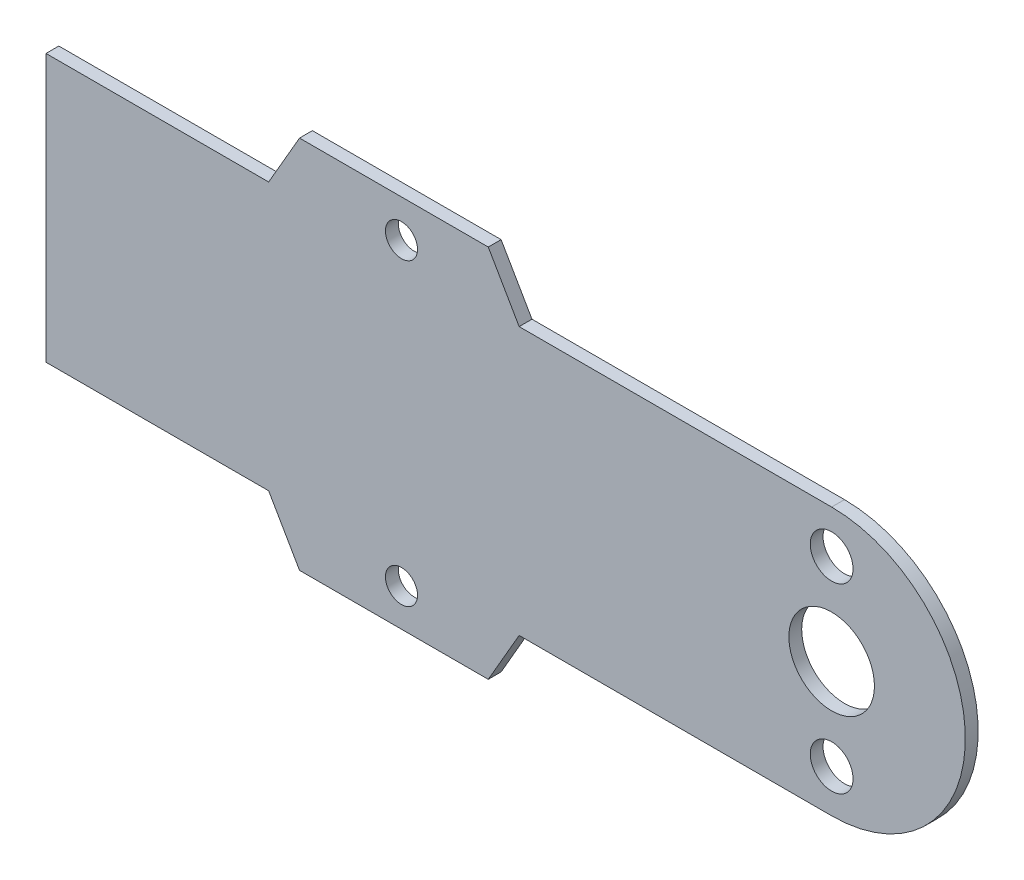
ISO-10303-21;
HEADER;
FILE_DESCRIPTION(('STEP AP214'),'2;1');
FILE_NAME('part.step','',(''),(''),'','','');
FILE_SCHEMA(('AUTOMOTIVE_DESIGN { 1 0 10303 214 1 1 1 1 }'));
ENDSEC;
DATA;
#1=APPLICATION_CONTEXT('core data for automotive mechanical design processes');
#2=APPLICATION_PROTOCOL_DEFINITION('international standard','automotive_design',2000,#1);
#3=PRODUCT_CONTEXT('',#1,'mechanical');
#4=PRODUCT('Part','Part','',(#3));
#5=PRODUCT_RELATED_PRODUCT_CATEGORY('part','',(#4));
#6=PRODUCT_DEFINITION_FORMATION('','',#4);
#7=PRODUCT_DEFINITION_CONTEXT('part definition',#1,'design');
#8=PRODUCT_DEFINITION('design','',#6,#7);
#9=PRODUCT_DEFINITION_SHAPE('','',#8);
#10=(LENGTH_UNIT() NAMED_UNIT(*) SI_UNIT(.MILLI.,.METRE.));
#11=(NAMED_UNIT(*) PLANE_ANGLE_UNIT() SI_UNIT($,.RADIAN.));
#12=(NAMED_UNIT(*) SI_UNIT($,.STERADIAN.) SOLID_ANGLE_UNIT());
#13=UNCERTAINTY_MEASURE_WITH_UNIT(LENGTH_MEASURE(1.E-05),#10,'distance_accuracy_value','');
#14=(GEOMETRIC_REPRESENTATION_CONTEXT(3) GLOBAL_UNCERTAINTY_ASSIGNED_CONTEXT((#13)) GLOBAL_UNIT_ASSIGNED_CONTEXT((#10,
#11,#12)) REPRESENTATION_CONTEXT('',''));
#15=CARTESIAN_POINT('',(0.,0.,0.));
#16=DIRECTION('',(0.,0.,1.));
#17=DIRECTION('',(1.,0.,0.));
#18=AXIS2_PLACEMENT_3D('',#15,#16,#17);
#19=CARTESIAN_POINT('',(60.9424777960769,12.5,1.2));
#20=DIRECTION('',(0.,0.,-1.));
#21=DIRECTION('',(-1.,0.,0.));
#22=AXIS2_PLACEMENT_3D('',#19,#20,#21);
#23=PLANE('',#22);
#24=CARTESIAN_POINT('',(73.4424777960769,8.5,1.2));
#25=DIRECTION('',(0.,0.,1.));
#26=DIRECTION('',(1.,0.,0.));
#27=AXIS2_PLACEMENT_3D('',#24,#25,#26);
#28=CIRCLE('',#27,2.);
#29=CARTESIAN_POINT('',(75.4424777960769,8.5,1.2));
#30=VERTEX_POINT('',#29);
#31=EDGE_CURVE('E163',#30,#30,#28,.T.);
#32=ORIENTED_EDGE('',*,*,#31,.F.);
#33=EDGE_LOOP('',(#32));
#34=FACE_BOUND('',#33,.T.);
#35=CARTESIAN_POINT('',(73.4424777960769,-8.5,1.2));
#36=DIRECTION('',(0.,0.,1.));
#37=DIRECTION('',(1.,0.,0.));
#38=AXIS2_PLACEMENT_3D('',#35,#36,#37);
#39=CIRCLE('',#38,2.);
#40=CARTESIAN_POINT('',(75.4424777960769,-8.5,1.2));
#41=VERTEX_POINT('',#40);
#42=EDGE_CURVE('E167',#41,#41,#39,.T.);
#43=ORIENTED_EDGE('',*,*,#42,.F.);
#44=EDGE_LOOP('',(#43));
#45=FACE_BOUND('',#44,.T.);
#46=CARTESIAN_POINT('',(73.4424777960769,0.,1.2));
#47=DIRECTION('',(0.,0.,1.));
#48=DIRECTION('',(1.,0.,0.));
#49=AXIS2_PLACEMENT_3D('',#46,#47,#48);
#50=CIRCLE('',#49,4.);
#51=CARTESIAN_POINT('',(77.4424777960769,0.,1.2));
#52=VERTEX_POINT('',#51);
#53=EDGE_CURVE('E170',#52,#52,#50,.T.);
#54=ORIENTED_EDGE('',*,*,#53,.F.);
#55=EDGE_LOOP('',(#54));
#56=FACE_BOUND('',#55,.T.);
#57=CARTESIAN_POINT('',(73.4424777960769,0.,1.2));
#58=DIRECTION('',(0.,0.,-1.));
#59=DIRECTION('',(-1.,0.,0.));
#60=AXIS2_PLACEMENT_3D('',#57,#58,#59);
#61=CIRCLE('',#60,12.5);
#62=CARTESIAN_POINT('',(73.4424777960769,12.5,1.2));
#63=VERTEX_POINT('',#62);
#64=CARTESIAN_POINT('',(73.4424777960769,-12.5,1.2));
#65=VERTEX_POINT('',#64);
#66=EDGE_CURVE('E62',#63,#65,#61,.T.);
#67=ORIENTED_EDGE('',*,*,#66,.F.);
#68=DIRECTION('',(1.,0.,0.));
#69=VECTOR('',#68,1.);
#70=CARTESIAN_POINT('',(60.9424777960769,12.5,1.2));
#71=LINE('',#70,#69);
#72=CARTESIAN_POINT('',(44.2305894825381,12.5,1.2));
#73=VERTEX_POINT('',#72);
#74=EDGE_CURVE('E48',#73,#63,#71,.T.);
#75=ORIENTED_EDGE('',*,*,#74,.F.);
#76=DIRECTION('',(0.500000000000003,-0.866025403784437,0.));
#77=VECTOR('',#76,1.);
#78=CARTESIAN_POINT('',(44.2305894825381,12.5,1.2));
#79=LINE('',#78,#77);
#80=CARTESIAN_POINT('',(41.34383813659,17.5,1.2));
#81=VERTEX_POINT('',#80);
#82=EDGE_CURVE('E244',#81,#73,#79,.T.);
#83=ORIENTED_EDGE('',*,*,#82,.F.);
#84=DIRECTION('',(1.,0.,0.));
#85=VECTOR('',#84,1.);
#86=CARTESIAN_POINT('',(41.34383813659,17.5,1.2));
#87=LINE('',#86,#85);
#88=CARTESIAN_POINT('',(23.7002675103244,17.5,1.2));
#89=VERTEX_POINT('',#88);
#90=EDGE_CURVE('E239',#89,#81,#87,.T.);
#91=ORIENTED_EDGE('',*,*,#90,.F.);
#92=DIRECTION('',(0.500000000000004,0.866025403784437,0.));
#93=VECTOR('',#92,1.);
#94=CARTESIAN_POINT('',(23.7002675103244,17.5,1.2));
#95=LINE('',#94,#93);
#96=CARTESIAN_POINT('',(20.8135161643762,12.5,1.2));
#97=VERTEX_POINT('',#96);
#98=EDGE_CURVE('E234',#97,#89,#95,.T.);
#99=ORIENTED_EDGE('',*,*,#98,.F.);
#100=DIRECTION('',(1.,0.,0.));
#101=VECTOR('',#100,1.);
#102=CARTESIAN_POINT('',(0.,12.5,1.2));
#103=LINE('',#102,#101);
#104=CARTESIAN_POINT('',(0.,12.5,1.2));
#105=VERTEX_POINT('',#104);
#106=EDGE_CURVE('E229',#105,#97,#103,.T.);
#107=ORIENTED_EDGE('',*,*,#106,.F.);
#108=DIRECTION('',(0.,-1.,0.));
#109=VECTOR('',#108,1.);
#110=CARTESIAN_POINT('',(0.,12.5,1.2));
#111=LINE('',#110,#109);
#112=CARTESIAN_POINT('',(0.,-12.5,1.2));
#113=VERTEX_POINT('',#112);
#114=EDGE_CURVE('E173',#105,#113,#111,.T.);
#115=ORIENTED_EDGE('',*,*,#114,.T.);
#116=DIRECTION('',(1.,0.,0.));
#117=VECTOR('',#116,1.);
#118=CARTESIAN_POINT('',(0.,-12.5,1.2));
#119=LINE('',#118,#117);
#120=CARTESIAN_POINT('',(20.8135161643762,-12.5,1.2));
#121=VERTEX_POINT('',#120);
#122=EDGE_CURVE('E155',#113,#121,#119,.T.);
#123=ORIENTED_EDGE('',*,*,#122,.T.);
#124=DIRECTION('',(-0.500000000000004,0.866025403784436,0.));
#125=VECTOR('',#124,1.);
#126=CARTESIAN_POINT('',(23.7002675103244,-17.5,1.2));
#127=LINE('',#126,#125);
#128=CARTESIAN_POINT('',(23.7002675103244,-17.5,1.2));
#129=VERTEX_POINT('',#128);
#130=EDGE_CURVE('E142',#129,#121,#127,.T.);
#131=ORIENTED_EDGE('',*,*,#130,.F.);
#132=DIRECTION('',(-1.,0.,0.));
#133=VECTOR('',#132,1.);
#134=CARTESIAN_POINT('',(41.34383813659,-17.5,1.2));
#135=LINE('',#134,#133);
#136=CARTESIAN_POINT('',(41.34383813659,-17.5,1.2));
#137=VERTEX_POINT('',#136);
#138=EDGE_CURVE('E147',#137,#129,#135,.T.);
#139=ORIENTED_EDGE('',*,*,#138,.F.);
#140=DIRECTION('',(-0.500000000000003,-0.866025403784437,0.));
#141=VECTOR('',#140,1.);
#142=CARTESIAN_POINT('',(44.2305894825381,-12.5,1.2));
#143=LINE('',#142,#141);
#144=CARTESIAN_POINT('',(44.2305894825381,-12.5,1.2));
#145=VERTEX_POINT('',#144);
#146=EDGE_CURVE('E146',#145,#137,#143,.T.);
#147=ORIENTED_EDGE('',*,*,#146,.F.);
#148=DIRECTION('',(1.,0.,0.));
#149=VECTOR('',#148,1.);
#150=CARTESIAN_POINT('',(60.9424777960769,-12.5,1.2));
#151=LINE('',#150,#149);
#152=EDGE_CURVE('E178',#145,#65,#151,.T.);
#153=ORIENTED_EDGE('',*,*,#152,.T.);
#154=EDGE_LOOP('',(#67,#75,#83,#91,#99,#107,#115,#123,#131,#139,#147,#153));
#155=FACE_BOUND('',#154,.T.);
#156=CARTESIAN_POINT('',(33.2305894825381,14.,1.2));
#157=DIRECTION('',(0.,0.,-1.));
#158=DIRECTION('',(-1.,0.,0.));
#159=AXIS2_PLACEMENT_3D('',#156,#157,#158);
#160=CIRCLE('',#159,1.5);
#161=CARTESIAN_POINT('',(31.7305894825381,14.,1.2));
#162=VERTEX_POINT('',#161);
#163=EDGE_CURVE('E299',#162,#162,#160,.T.);
#164=ORIENTED_EDGE('',*,*,#163,.T.);
#165=EDGE_LOOP('',(#164));
#166=FACE_BOUND('',#165,.T.);
#167=CARTESIAN_POINT('',(33.2305894825381,-14.,1.2));
#168=DIRECTION('',(0.,0.,-1.));
#169=DIRECTION('',(-1.,0.,0.));
#170=AXIS2_PLACEMENT_3D('',#167,#168,#169);
#171=CIRCLE('',#170,1.5);
#172=CARTESIAN_POINT('',(31.7305894825381,-14.,1.2));
#173=VERTEX_POINT('',#172);
#174=EDGE_CURVE('E294',#173,#173,#171,.T.);
#175=ORIENTED_EDGE('',*,*,#174,.T.);
#176=EDGE_LOOP('',(#175));
#177=FACE_BOUND('',#176,.T.);
#178=ADVANCED_FACE('F39',(#34,#45,#56,#155,#166,#177),#23,.F.);
#179=CARTESIAN_POINT('',(0.,12.5,0.));
#180=DIRECTION('',(0.,0.,-1.));
#181=DIRECTION('',(-1.,0.,0.));
#182=AXIS2_PLACEMENT_3D('',#179,#180,#181);
#183=PLANE('',#182);
#184=CARTESIAN_POINT('',(73.4424777960769,8.5,0.));
#185=DIRECTION('',(0.,0.,-1.));
#186=DIRECTION('',(-1.,0.,0.));
#187=AXIS2_PLACEMENT_3D('',#184,#185,#186);
#188=CIRCLE('',#187,2.);
#189=CARTESIAN_POINT('',(71.4424777960769,8.5,0.));
#190=VERTEX_POINT('',#189);
#191=EDGE_CURVE('E43',#190,#190,#188,.T.);
#192=ORIENTED_EDGE('',*,*,#191,.F.);
#193=EDGE_LOOP('',(#192));
#194=FACE_BOUND('',#193,.T.);
#195=CARTESIAN_POINT('',(73.4424777960769,-8.5,0.));
#196=DIRECTION('',(0.,0.,-1.));
#197=DIRECTION('',(-1.,0.,0.));
#198=AXIS2_PLACEMENT_3D('',#195,#196,#197);
#199=CIRCLE('',#198,2.);
#200=CARTESIAN_POINT('',(71.4424777960769,-8.5,0.));
#201=VERTEX_POINT('',#200);
#202=EDGE_CURVE('E188',#201,#201,#199,.T.);
#203=ORIENTED_EDGE('',*,*,#202,.F.);
#204=EDGE_LOOP('',(#203));
#205=FACE_BOUND('',#204,.T.);
#206=CARTESIAN_POINT('',(73.4424777960769,0.,0.));
#207=DIRECTION('',(0.,0.,-1.));
#208=DIRECTION('',(-1.,0.,0.));
#209=AXIS2_PLACEMENT_3D('',#206,#207,#208);
#210=CIRCLE('',#209,4.);
#211=CARTESIAN_POINT('',(69.4424777960769,0.,0.));
#212=VERTEX_POINT('',#211);
#213=EDGE_CURVE('E166',#212,#212,#210,.T.);
#214=ORIENTED_EDGE('',*,*,#213,.F.);
#215=EDGE_LOOP('',(#214));
#216=FACE_BOUND('',#215,.T.);
#217=DIRECTION('',(1.,0.,0.));
#218=VECTOR('',#217,1.);
#219=CARTESIAN_POINT('',(60.9424777960769,12.5,0.));
#220=LINE('',#219,#218);
#221=CARTESIAN_POINT('',(44.2305894825381,12.5,0.));
#222=VERTEX_POINT('',#221);
#223=CARTESIAN_POINT('',(73.4424777960769,12.5,0.));
#224=VERTEX_POINT('',#223);
#225=EDGE_CURVE('E12',#222,#224,#220,.T.);
#226=ORIENTED_EDGE('',*,*,#225,.T.);
#227=CARTESIAN_POINT('',(73.4424777960769,0.,0.));
#228=DIRECTION('',(0.,0.,-1.));
#229=DIRECTION('',(-1.,0.,0.));
#230=AXIS2_PLACEMENT_3D('',#227,#228,#229);
#231=CIRCLE('',#230,12.5);
#232=CARTESIAN_POINT('',(73.4424777960769,-12.5,0.));
#233=VERTEX_POINT('',#232);
#234=EDGE_CURVE('E56',#224,#233,#231,.T.);
#235=ORIENTED_EDGE('',*,*,#234,.T.);
#236=DIRECTION('',(1.,0.,0.));
#237=VECTOR('',#236,1.);
#238=CARTESIAN_POINT('',(60.9424777960769,-12.5,0.));
#239=LINE('',#238,#237);
#240=CARTESIAN_POINT('',(44.2305894825381,-12.5,0.));
#241=VERTEX_POINT('',#240);
#242=EDGE_CURVE('E181',#241,#233,#239,.T.);
#243=ORIENTED_EDGE('',*,*,#242,.F.);
#244=DIRECTION('',(-0.500000000000003,-0.866025403784437,0.));
#245=VECTOR('',#244,1.);
#246=CARTESIAN_POINT('',(44.2305894825381,-12.5,0.));
#247=LINE('',#246,#245);
#248=CARTESIAN_POINT('',(41.34383813659,-17.5,0.));
#249=VERTEX_POINT('',#248);
#250=EDGE_CURVE('E255',#241,#249,#247,.T.);
#251=ORIENTED_EDGE('',*,*,#250,.T.);
#252=DIRECTION('',(-1.,0.,0.));
#253=VECTOR('',#252,1.);
#254=CARTESIAN_POINT('',(41.34383813659,-17.5,0.));
#255=LINE('',#254,#253);
#256=CARTESIAN_POINT('',(23.7002675103244,-17.5,0.));
#257=VERTEX_POINT('',#256);
#258=EDGE_CURVE('E256',#249,#257,#255,.T.);
#259=ORIENTED_EDGE('',*,*,#258,.T.);
#260=DIRECTION('',(-0.500000000000004,0.866025403784436,0.));
#261=VECTOR('',#260,1.);
#262=CARTESIAN_POINT('',(23.7002675103244,-17.5,0.));
#263=LINE('',#262,#261);
#264=CARTESIAN_POINT('',(20.8135161643762,-12.5,0.));
#265=VERTEX_POINT('',#264);
#266=EDGE_CURVE('E144',#257,#265,#263,.T.);
#267=ORIENTED_EDGE('',*,*,#266,.T.);
#268=DIRECTION('',(1.,0.,0.));
#269=VECTOR('',#268,1.);
#270=CARTESIAN_POINT('',(0.,-12.5,0.));
#271=LINE('',#270,#269);
#272=CARTESIAN_POINT('',(0.,-12.5,0.));
#273=VERTEX_POINT('',#272);
#274=EDGE_CURVE('E214',#273,#265,#271,.T.);
#275=ORIENTED_EDGE('',*,*,#274,.F.);
#276=DIRECTION('',(0.,-1.,0.));
#277=VECTOR('',#276,1.);
#278=CARTESIAN_POINT('',(0.,12.5,0.));
#279=LINE('',#278,#277);
#280=CARTESIAN_POINT('',(0.,12.5,0.));
#281=VERTEX_POINT('',#280);
#282=EDGE_CURVE('E224',#281,#273,#279,.T.);
#283=ORIENTED_EDGE('',*,*,#282,.F.);
#284=DIRECTION('',(1.,0.,0.));
#285=VECTOR('',#284,1.);
#286=CARTESIAN_POINT('',(0.,12.5,0.));
#287=LINE('',#286,#285);
#288=CARTESIAN_POINT('',(20.8135161643762,12.5,0.));
#289=VERTEX_POINT('',#288);
#290=EDGE_CURVE('E216',#281,#289,#287,.T.);
#291=ORIENTED_EDGE('',*,*,#290,.T.);
#292=DIRECTION('',(0.500000000000004,0.866025403784437,0.));
#293=VECTOR('',#292,1.);
#294=CARTESIAN_POINT('',(23.7002675103244,17.5,0.));
#295=LINE('',#294,#293);
#296=CARTESIAN_POINT('',(23.7002675103244,17.5,0.));
#297=VERTEX_POINT('',#296);
#298=EDGE_CURVE('E265',#289,#297,#295,.T.);
#299=ORIENTED_EDGE('',*,*,#298,.T.);
#300=DIRECTION('',(1.,0.,0.));
#301=VECTOR('',#300,1.);
#302=CARTESIAN_POINT('',(41.34383813659,17.5,0.));
#303=LINE('',#302,#301);
#304=CARTESIAN_POINT('',(41.34383813659,17.5,0.));
#305=VERTEX_POINT('',#304);
#306=EDGE_CURVE('E260',#297,#305,#303,.T.);
#307=ORIENTED_EDGE('',*,*,#306,.T.);
#308=DIRECTION('',(0.500000000000003,-0.866025403784437,0.));
#309=VECTOR('',#308,1.);
#310=CARTESIAN_POINT('',(44.2305894825381,12.5,0.));
#311=LINE('',#310,#309);
#312=EDGE_CURVE('E257',#305,#222,#311,.T.);
#313=ORIENTED_EDGE('',*,*,#312,.T.);
#314=EDGE_LOOP('',(#226,#235,#243,#251,#259,#267,#275,#283,#291,#299,#307,#313));
#315=FACE_BOUND('',#314,.T.);
#316=CARTESIAN_POINT('',(33.2305894825381,14.,0.));
#317=DIRECTION('',(0.,0.,-1.));
#318=DIRECTION('',(-1.,0.,0.));
#319=AXIS2_PLACEMENT_3D('',#316,#317,#318);
#320=CIRCLE('',#319,1.5);
#321=CARTESIAN_POINT('',(31.7305894825381,14.,0.));
#322=VERTEX_POINT('',#321);
#323=EDGE_CURVE('E209',#322,#322,#320,.T.);
#324=ORIENTED_EDGE('',*,*,#323,.F.);
#325=EDGE_LOOP('',(#324));
#326=FACE_BOUND('',#325,.T.);
#327=CARTESIAN_POINT('',(33.2305894825381,-14.,0.));
#328=DIRECTION('',(0.,0.,-1.));
#329=DIRECTION('',(-1.,0.,0.));
#330=AXIS2_PLACEMENT_3D('',#327,#328,#329);
#331=CIRCLE('',#330,1.5);
#332=CARTESIAN_POINT('',(31.7305894825381,-14.,0.));
#333=VERTEX_POINT('',#332);
#334=EDGE_CURVE('E212',#333,#333,#331,.T.);
#335=ORIENTED_EDGE('',*,*,#334,.F.);
#336=EDGE_LOOP('',(#335));
#337=FACE_BOUND('',#336,.T.);
#338=ADVANCED_FACE('F41',(#194,#205,#216,#315,#326,#337),#183,.T.);
#339=CARTESIAN_POINT('',(60.9424777960769,-12.5,0.));
#340=DIRECTION('',(0.,-1.,0.));
#341=DIRECTION('',(1.,0.,0.));
#342=AXIS2_PLACEMENT_3D('',#339,#340,#341);
#343=PLANE('',#342);
#344=DIRECTION('',(0.,0.,-1.));
#345=VECTOR('',#344,1.);
#346=CARTESIAN_POINT('',(73.4424777960769,-12.5,0.));
#347=LINE('',#346,#345);
#348=EDGE_CURVE('E70',#233,#65,#347,.F.);
#349=ORIENTED_EDGE('',*,*,#348,.T.);
#350=ORIENTED_EDGE('',*,*,#152,.F.);
#351=DIRECTION('',(0.,0.,-1.));
#352=VECTOR('',#351,1.);
#353=CARTESIAN_POINT('',(44.2305894825381,-12.5,1.2));
#354=LINE('',#353,#352);
#355=EDGE_CURVE('E252',#145,#241,#354,.T.);
#356=ORIENTED_EDGE('',*,*,#355,.T.);
#357=ORIENTED_EDGE('',*,*,#242,.T.);
#358=EDGE_LOOP('',(#349,#350,#356,#357));
#359=FACE_BOUND('',#358,.T.);
#360=ADVANCED_FACE('F200',(#359),#343,.T.);
#361=CARTESIAN_POINT('',(60.9424777960769,12.5,-60.));
#362=DIRECTION('',(0.,-1.,0.));
#363=DIRECTION('',(0.,0.,-1.));
#364=AXIS2_PLACEMENT_3D('',#361,#362,#363);
#365=PLANE('',#364);
#366=ORIENTED_EDGE('',*,*,#74,.T.);
#367=DIRECTION('',(0.,0.,-1.));
#368=VECTOR('',#367,1.);
#369=CARTESIAN_POINT('',(73.4424777960769,12.5,0.));
#370=LINE('',#369,#368);
#371=EDGE_CURVE('E175',#224,#63,#370,.F.);
#372=ORIENTED_EDGE('',*,*,#371,.F.);
#373=ORIENTED_EDGE('',*,*,#225,.F.);
#374=DIRECTION('',(0.,0.,-1.));
#375=VECTOR('',#374,1.);
#376=CARTESIAN_POINT('',(44.2305894825381,12.5,1.2));
#377=LINE('',#376,#375);
#378=EDGE_CURVE('E242',#73,#222,#377,.T.);
#379=ORIENTED_EDGE('',*,*,#378,.F.);
#380=EDGE_LOOP('',(#366,#372,#373,#379));
#381=FACE_BOUND('',#380,.T.);
#382=ADVANCED_FACE('F283',(#381),#365,.F.);
#383=CARTESIAN_POINT('',(73.4424777960769,0.,0.));
#384=DIRECTION('',(0.,0.,-1.));
#385=DIRECTION('',(-1.,0.,0.));
#386=AXIS2_PLACEMENT_3D('',#383,#384,#385);
#387=CYLINDRICAL_SURFACE('',#386,12.5);
#388=ORIENTED_EDGE('',*,*,#348,.F.);
#389=ORIENTED_EDGE('',*,*,#234,.F.);
#390=ORIENTED_EDGE('',*,*,#371,.T.);
#391=ORIENTED_EDGE('',*,*,#66,.T.);
#392=EDGE_LOOP('',(#388,#389,#390,#391));
#393=FACE_BOUND('',#392,.T.);
#394=ADVANCED_FACE('F327',(#393),#387,.T.);
#395=CARTESIAN_POINT('',(73.4424777960769,0.,-8.8));
#396=DIRECTION('',(0.,0.,1.));
#397=DIRECTION('',(1.,0.,0.));
#398=AXIS2_PLACEMENT_3D('',#395,#396,#397);
#399=CYLINDRICAL_SURFACE('',#398,4.);
#400=ORIENTED_EDGE('',*,*,#213,.T.);
#401=EDGE_LOOP('',(#400));
#402=FACE_BOUND('',#401,.T.);
#403=ORIENTED_EDGE('',*,*,#53,.T.);
#404=EDGE_LOOP('',(#403));
#405=FACE_BOUND('',#404,.T.);
#406=ADVANCED_FACE('F331',(#402,#405),#399,.F.);
#407=CARTESIAN_POINT('',(73.4424777960769,-8.5,-8.8));
#408=DIRECTION('',(0.,0.,1.));
#409=DIRECTION('',(1.,0.,0.));
#410=AXIS2_PLACEMENT_3D('',#407,#408,#409);
#411=CYLINDRICAL_SURFACE('',#410,2.);
#412=ORIENTED_EDGE('',*,*,#202,.T.);
#413=EDGE_LOOP('',(#412));
#414=FACE_BOUND('',#413,.T.);
#415=ORIENTED_EDGE('',*,*,#42,.T.);
#416=EDGE_LOOP('',(#415));
#417=FACE_BOUND('',#416,.T.);
#418=ADVANCED_FACE('F335',(#414,#417),#411,.F.);
#419=CARTESIAN_POINT('',(73.4424777960769,8.5,-8.8));
#420=DIRECTION('',(0.,0.,1.));
#421=DIRECTION('',(1.,0.,0.));
#422=AXIS2_PLACEMENT_3D('',#419,#420,#421);
#423=CYLINDRICAL_SURFACE('',#422,2.);
#424=ORIENTED_EDGE('',*,*,#191,.T.);
#425=EDGE_LOOP('',(#424));
#426=FACE_BOUND('',#425,.T.);
#427=ORIENTED_EDGE('',*,*,#31,.T.);
#428=EDGE_LOOP('',(#427));
#429=FACE_BOUND('',#428,.T.);
#430=ADVANCED_FACE('F195',(#426,#429),#423,.F.);
#431=CARTESIAN_POINT('',(23.7002675103244,-17.5,1.2));
#432=DIRECTION('',(-0.866025403784436,-0.500000000000004,0.));
#433=DIRECTION('',(0.500000000000004,-0.866025403784436,0.));
#434=AXIS2_PLACEMENT_3D('',#431,#432,#433);
#435=PLANE('',#434);
#436=ORIENTED_EDGE('',*,*,#266,.F.);
#437=DIRECTION('',(0.,0.,-1.));
#438=VECTOR('',#437,1.);
#439=CARTESIAN_POINT('',(23.7002675103244,-17.5,1.2));
#440=LINE('',#439,#438);
#441=EDGE_CURVE('E138',#129,#257,#440,.T.);
#442=ORIENTED_EDGE('',*,*,#441,.F.);
#443=ORIENTED_EDGE('',*,*,#130,.T.);
#444=DIRECTION('',(0.,0.,-1.));
#445=VECTOR('',#444,1.);
#446=CARTESIAN_POINT('',(20.8135161643762,-12.5,1.2));
#447=LINE('',#446,#445);
#448=EDGE_CURVE('E156',#121,#265,#447,.T.);
#449=ORIENTED_EDGE('',*,*,#448,.T.);
#450=EDGE_LOOP('',(#436,#442,#443,#449));
#451=FACE_BOUND('',#450,.T.);
#452=ADVANCED_FACE('F140',(#451),#435,.T.);
#453=CARTESIAN_POINT('',(41.34383813659,-17.5,1.2));
#454=DIRECTION('',(0.,-1.,0.));
#455=DIRECTION('',(1.,0.,0.));
#456=AXIS2_PLACEMENT_3D('',#453,#454,#455);
#457=PLANE('',#456);
#458=ORIENTED_EDGE('',*,*,#258,.F.);
#459=DIRECTION('',(0.,0.,-1.));
#460=VECTOR('',#459,1.);
#461=CARTESIAN_POINT('',(41.34383813659,-17.5,1.2));
#462=LINE('',#461,#460);
#463=EDGE_CURVE('E132',#137,#249,#462,.T.);
#464=ORIENTED_EDGE('',*,*,#463,.F.);
#465=ORIENTED_EDGE('',*,*,#138,.T.);
#466=ORIENTED_EDGE('',*,*,#441,.T.);
#467=EDGE_LOOP('',(#458,#464,#465,#466));
#468=FACE_BOUND('',#467,.T.);
#469=ADVANCED_FACE('F158',(#468),#457,.T.);
#470=CARTESIAN_POINT('',(44.2305894825381,-12.5,1.2));
#471=DIRECTION('',(0.866025403784437,-0.500000000000003,0.));
#472=DIRECTION('',(0.500000000000003,0.866025403784437,0.));
#473=AXIS2_PLACEMENT_3D('',#470,#471,#472);
#474=PLANE('',#473);
#475=ORIENTED_EDGE('',*,*,#250,.F.);
#476=ORIENTED_EDGE('',*,*,#355,.F.);
#477=ORIENTED_EDGE('',*,*,#146,.T.);
#478=ORIENTED_EDGE('',*,*,#463,.T.);
#479=EDGE_LOOP('',(#475,#476,#477,#478));
#480=FACE_BOUND('',#479,.T.);
#481=ADVANCED_FACE('F250',(#480),#474,.T.);
#482=CARTESIAN_POINT('',(44.2305894825381,12.5,1.2));
#483=DIRECTION('',(0.866025403784437,0.500000000000003,0.));
#484=DIRECTION('',(-0.500000000000003,0.866025403784437,0.));
#485=AXIS2_PLACEMENT_3D('',#482,#483,#484);
#486=PLANE('',#485);
#487=ORIENTED_EDGE('',*,*,#312,.F.);
#488=DIRECTION('',(0.,0.,-1.));
#489=VECTOR('',#488,1.);
#490=CARTESIAN_POINT('',(41.34383813659,17.5,1.2));
#491=LINE('',#490,#489);
#492=EDGE_CURVE('E237',#81,#305,#491,.T.);
#493=ORIENTED_EDGE('',*,*,#492,.F.);
#494=ORIENTED_EDGE('',*,*,#82,.T.);
#495=ORIENTED_EDGE('',*,*,#378,.T.);
#496=EDGE_LOOP('',(#487,#493,#494,#495));
#497=FACE_BOUND('',#496,.T.);
#498=ADVANCED_FACE('F282',(#497),#486,.T.);
#499=CARTESIAN_POINT('',(41.34383813659,17.5,1.2));
#500=DIRECTION('',(0.,1.,0.));
#501=DIRECTION('',(-1.,0.,0.));
#502=AXIS2_PLACEMENT_3D('',#499,#500,#501);
#503=PLANE('',#502);
#504=ORIENTED_EDGE('',*,*,#306,.F.);
#505=DIRECTION('',(0.,0.,-1.));
#506=VECTOR('',#505,1.);
#507=CARTESIAN_POINT('',(23.7002675103244,17.5,1.2));
#508=LINE('',#507,#506);
#509=EDGE_CURVE('E232',#89,#297,#508,.T.);
#510=ORIENTED_EDGE('',*,*,#509,.F.);
#511=ORIENTED_EDGE('',*,*,#90,.T.);
#512=ORIENTED_EDGE('',*,*,#492,.T.);
#513=EDGE_LOOP('',(#504,#510,#511,#512));
#514=FACE_BOUND('',#513,.T.);
#515=ADVANCED_FACE('F279',(#514),#503,.T.);
#516=CARTESIAN_POINT('',(23.7002675103244,17.5,1.2));
#517=DIRECTION('',(-0.866025403784437,0.500000000000004,0.));
#518=DIRECTION('',(-0.500000000000004,-0.866025403784437,0.));
#519=AXIS2_PLACEMENT_3D('',#516,#517,#518);
#520=PLANE('',#519);
#521=ORIENTED_EDGE('',*,*,#298,.F.);
#522=DIRECTION('',(0.,0.,-1.));
#523=VECTOR('',#522,1.);
#524=CARTESIAN_POINT('',(20.8135161643762,12.5,1.2));
#525=LINE('',#524,#523);
#526=EDGE_CURVE('E230',#97,#289,#525,.T.);
#527=ORIENTED_EDGE('',*,*,#526,.F.);
#528=ORIENTED_EDGE('',*,*,#98,.T.);
#529=ORIENTED_EDGE('',*,*,#509,.T.);
#530=EDGE_LOOP('',(#521,#527,#528,#529));
#531=FACE_BOUND('',#530,.T.);
#532=ADVANCED_FACE('F275',(#531),#520,.T.);
#533=CARTESIAN_POINT('',(60.,12.5,0.));
#534=DIRECTION('',(0.,1.,0.));
#535=DIRECTION('',(0.,0.,1.));
#536=AXIS2_PLACEMENT_3D('',#533,#534,#535);
#537=PLANE('',#536);
#538=ORIENTED_EDGE('',*,*,#526,.T.);
#539=ORIENTED_EDGE('',*,*,#290,.F.);
#540=DIRECTION('',(0.,0.,-1.));
#541=VECTOR('',#540,1.);
#542=CARTESIAN_POINT('',(0.,12.5,1.2));
#543=LINE('',#542,#541);
#544=EDGE_CURVE('E226',#105,#281,#543,.T.);
#545=ORIENTED_EDGE('',*,*,#544,.F.);
#546=ORIENTED_EDGE('',*,*,#106,.T.);
#547=EDGE_LOOP('',(#538,#539,#545,#546));
#548=FACE_BOUND('',#547,.T.);
#549=ADVANCED_FACE('F288',(#548),#537,.T.);
#550=CARTESIAN_POINT('',(0.,12.5,1.2));
#551=DIRECTION('',(-1.,0.,0.));
#552=DIRECTION('',(0.,0.,1.));
#553=AXIS2_PLACEMENT_3D('',#550,#551,#552);
#554=PLANE('',#553);
#555=DIRECTION('',(0.,0.,-1.));
#556=VECTOR('',#555,1.);
#557=CARTESIAN_POINT('',(0.,-12.5,1.2));
#558=LINE('',#557,#556);
#559=EDGE_CURVE('E218',#113,#273,#558,.T.);
#560=ORIENTED_EDGE('',*,*,#559,.F.);
#561=ORIENTED_EDGE('',*,*,#114,.F.);
#562=ORIENTED_EDGE('',*,*,#544,.T.);
#563=ORIENTED_EDGE('',*,*,#282,.T.);
#564=EDGE_LOOP('',(#560,#561,#562,#563));
#565=FACE_BOUND('',#564,.T.);
#566=ADVANCED_FACE('F291',(#565),#554,.T.);
#567=CARTESIAN_POINT('',(0.,-12.5,0.));
#568=DIRECTION('',(0.,-1.,0.));
#569=DIRECTION('',(-1.,0.,0.));
#570=AXIS2_PLACEMENT_3D('',#567,#568,#569);
#571=PLANE('',#570);
#572=ORIENTED_EDGE('',*,*,#448,.F.);
#573=ORIENTED_EDGE('',*,*,#122,.F.);
#574=ORIENTED_EDGE('',*,*,#559,.T.);
#575=ORIENTED_EDGE('',*,*,#274,.T.);
#576=EDGE_LOOP('',(#572,#573,#574,#575));
#577=FACE_BOUND('',#576,.T.);
#578=ADVANCED_FACE('F303',(#577),#571,.T.);
#579=CARTESIAN_POINT('',(33.2305894825381,-14.,10.));
#580=DIRECTION('',(0.,0.,-1.));
#581=DIRECTION('',(-1.,0.,0.));
#582=AXIS2_PLACEMENT_3D('',#579,#580,#581);
#583=CYLINDRICAL_SURFACE('',#582,1.5);
#584=ORIENTED_EDGE('',*,*,#334,.T.);
#585=EDGE_LOOP('',(#584));
#586=FACE_BOUND('',#585,.T.);
#587=ORIENTED_EDGE('',*,*,#174,.F.);
#588=EDGE_LOOP('',(#587));
#589=FACE_BOUND('',#588,.T.);
#590=ADVANCED_FACE('F305',(#586,#589),#583,.F.);
#591=CARTESIAN_POINT('',(33.2305894825381,14.,10.));
#592=DIRECTION('',(0.,0.,-1.));
#593=DIRECTION('',(-1.,0.,0.));
#594=AXIS2_PLACEMENT_3D('',#591,#592,#593);
#595=CYLINDRICAL_SURFACE('',#594,1.5);
#596=ORIENTED_EDGE('',*,*,#323,.T.);
#597=EDGE_LOOP('',(#596));
#598=FACE_BOUND('',#597,.T.);
#599=ORIENTED_EDGE('',*,*,#163,.F.);
#600=EDGE_LOOP('',(#599));
#601=FACE_BOUND('',#600,.T.);
#602=ADVANCED_FACE('F311',(#598,#601),#595,.F.);
#603=CLOSED_SHELL('',(#178,#338,#360,#382,#394,#406,#418,#430,#452,#469,#481,#498,#515,#532,
#549,#566,#578,#590,#602));
#604=MANIFOLD_SOLID_BREP('B2',#603);
#605=ADVANCED_BREP_SHAPE_REPRESENTATION('',(#18,#604),#14);
#606=SHAPE_DEFINITION_REPRESENTATION(#9,#605);
ENDSEC;
END-ISO-10303-21;
